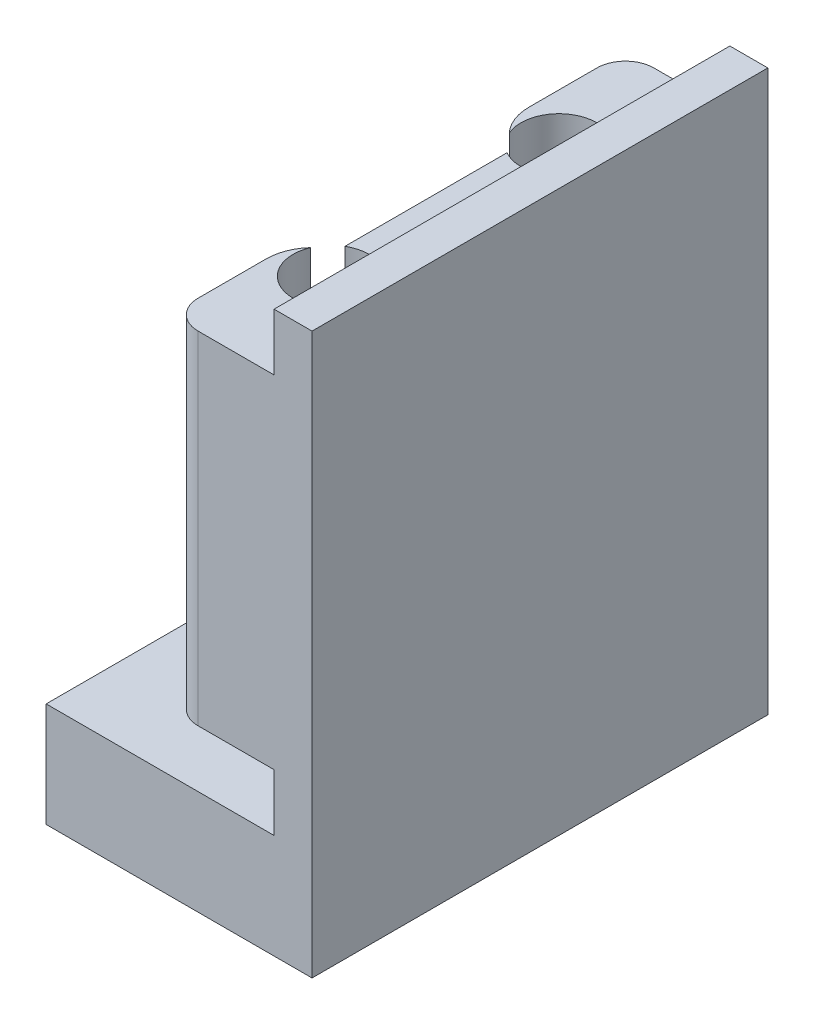
ISO-10303-21;
HEADER;
FILE_DESCRIPTION(('STEP AP214'),'2;1');
FILE_NAME('part.step','',(''),(''),'','','');
FILE_SCHEMA(('AUTOMOTIVE_DESIGN { 1 0 10303 214 1 1 1 1 }'));
ENDSEC;
DATA;
#1=APPLICATION_CONTEXT('core data for automotive mechanical design processes');
#2=APPLICATION_PROTOCOL_DEFINITION('international standard','automotive_design',2000,#1);
#3=PRODUCT_CONTEXT('',#1,'mechanical');
#4=PRODUCT('Part','Part','',(#3));
#5=PRODUCT_RELATED_PRODUCT_CATEGORY('part','',(#4));
#6=PRODUCT_DEFINITION_FORMATION('','',#4);
#7=PRODUCT_DEFINITION_CONTEXT('part definition',#1,'design');
#8=PRODUCT_DEFINITION('design','',#6,#7);
#9=PRODUCT_DEFINITION_SHAPE('','',#8);
#10=(LENGTH_UNIT() NAMED_UNIT(*) SI_UNIT(.MILLI.,.METRE.));
#11=(NAMED_UNIT(*) PLANE_ANGLE_UNIT() SI_UNIT($,.RADIAN.));
#12=(NAMED_UNIT(*) SI_UNIT($,.STERADIAN.) SOLID_ANGLE_UNIT());
#13=UNCERTAINTY_MEASURE_WITH_UNIT(LENGTH_MEASURE(1.E-05),#10,'distance_accuracy_value','');
#14=(GEOMETRIC_REPRESENTATION_CONTEXT(3) GLOBAL_UNCERTAINTY_ASSIGNED_CONTEXT((#13)) GLOBAL_UNIT_ASSIGNED_CONTEXT((#10,
#11,#12)) REPRESENTATION_CONTEXT('',''));
#15=CARTESIAN_POINT('',(0.,0.,0.));
#16=DIRECTION('',(0.,0.,1.));
#17=DIRECTION('',(1.,0.,0.));
#18=AXIS2_PLACEMENT_3D('',#15,#16,#17);
#19=CARTESIAN_POINT('',(0.500000000000001,26.5,12.));
#20=DIRECTION('',(1.,0.,0.));
#21=DIRECTION('',(0.,0.,-1.));
#22=AXIS2_PLACEMENT_3D('',#19,#20,#21);
#23=PLANE('',#22);
#24=DIRECTION('',(0.,0.,1.));
#25=VECTOR('',#24,1.);
#26=CARTESIAN_POINT('',(0.500000000000001,26.5,12.));
#27=LINE('',#26,#25);
#28=CARTESIAN_POINT('',(0.500000000000001,26.5,-10.5));
#29=VERTEX_POINT('',#28);
#30=CARTESIAN_POINT('',(0.500000000000001,26.5,-6.91628784747792));
#31=VERTEX_POINT('',#30);
#32=EDGE_CURVE('E200',#29,#31,#27,.T.);
#33=ORIENTED_EDGE('',*,*,#32,.F.);
#34=DIRECTION('',(0.,-1.,0.));
#35=VECTOR('',#34,1.);
#36=CARTESIAN_POINT('',(0.500000000000001,26.5,-10.5));
#37=LINE('',#36,#35);
#38=CARTESIAN_POINT('',(0.500000000000001,8.5,-10.5));
#39=VERTEX_POINT('',#38);
#40=EDGE_CURVE('E275',#29,#39,#37,.T.);
#41=ORIENTED_EDGE('',*,*,#40,.T.);
#42=DIRECTION('',(0.,0.,1.));
#43=VECTOR('',#42,1.);
#44=CARTESIAN_POINT('',(0.500000000000001,8.5,12.));
#45=LINE('',#44,#43);
#46=CARTESIAN_POINT('',(0.500000000000001,8.5,-6.91628784747792));
#47=VERTEX_POINT('',#46);
#48=EDGE_CURVE('E208',#39,#47,#45,.T.);
#49=ORIENTED_EDGE('',*,*,#48,.T.);
#50=DIRECTION('',(0.,1.,0.));
#51=VECTOR('',#50,1.);
#52=CARTESIAN_POINT('',(0.500000000000001,26.5,-6.91628784747792));
#53=LINE('',#52,#51);
#54=EDGE_CURVE('E268',#47,#31,#53,.T.);
#55=ORIENTED_EDGE('',*,*,#54,.T.);
#56=EDGE_LOOP('',(#33,#41,#49,#55));
#57=FACE_BOUND('',#56,.T.);
#58=ADVANCED_FACE('F34',(#57),#23,.F.);
#59=CARTESIAN_POINT('',(6.,29.5,12.));
#60=DIRECTION('',(1.,0.,0.));
#61=DIRECTION('',(0.,0.,-1.));
#62=AXIS2_PLACEMENT_3D('',#59,#60,#61);
#63=PLANE('',#62);
#64=DIRECTION('',(0.,0.,-1.));
#65=VECTOR('',#64,1.);
#66=CARTESIAN_POINT('',(6.,8.5,12.));
#67=LINE('',#66,#65);
#68=CARTESIAN_POINT('',(6.,8.5,12.));
#69=VERTEX_POINT('',#68);
#70=CARTESIAN_POINT('',(6.,8.5,-12.));
#71=VERTEX_POINT('',#70);
#72=EDGE_CURVE('E184',#69,#71,#67,.T.);
#73=ORIENTED_EDGE('',*,*,#72,.T.);
#74=DIRECTION('',(0.,-1.,0.));
#75=VECTOR('',#74,1.);
#76=CARTESIAN_POINT('',(6.,29.5,-12.));
#77=LINE('',#76,#75);
#78=CARTESIAN_POINT('',(6.,5.5,-12.));
#79=VERTEX_POINT('',#78);
#80=EDGE_CURVE('E220',#71,#79,#77,.T.);
#81=ORIENTED_EDGE('',*,*,#80,.T.);
#82=DIRECTION('',(0.,0.,-1.));
#83=VECTOR('',#82,1.);
#84=CARTESIAN_POINT('',(6.,5.5,12.));
#85=LINE('',#84,#83);
#86=CARTESIAN_POINT('',(6.,5.5,12.));
#87=VERTEX_POINT('',#86);
#88=EDGE_CURVE('E236',#87,#79,#85,.T.);
#89=ORIENTED_EDGE('',*,*,#88,.F.);
#90=DIRECTION('',(0.,-1.,0.));
#91=VECTOR('',#90,1.);
#92=CARTESIAN_POINT('',(6.,29.5,12.));
#93=LINE('',#92,#91);
#94=EDGE_CURVE('E231',#69,#87,#93,.T.);
#95=ORIENTED_EDGE('',*,*,#94,.F.);
#96=EDGE_LOOP('',(#73,#81,#89,#95));
#97=FACE_BOUND('',#96,.T.);
#98=ADVANCED_FACE('F301',(#97),#63,.F.);
#99=CARTESIAN_POINT('',(-6.,5.5,-12.));
#100=DIRECTION('',(0.,0.,1.));
#101=DIRECTION('',(1.,0.,0.));
#102=AXIS2_PLACEMENT_3D('',#99,#100,#101);
#103=PLANE('',#102);
#104=DIRECTION('',(-1.,0.,0.));
#105=VECTOR('',#104,1.);
#106=CARTESIAN_POINT('',(6.,8.5,-12.));
#107=LINE('',#106,#105);
#108=CARTESIAN_POINT('',(2.,8.5,-12.));
#109=VERTEX_POINT('',#108);
#110=EDGE_CURVE('E187',#71,#109,#107,.T.);
#111=ORIENTED_EDGE('',*,*,#110,.T.);
#112=DIRECTION('',(0.,-1.,0.));
#113=VECTOR('',#112,1.);
#114=CARTESIAN_POINT('',(2.,5.5,-12.));
#115=LINE('',#114,#113);
#116=CARTESIAN_POINT('',(2.,26.5,-12.));
#117=VERTEX_POINT('',#116);
#118=EDGE_CURVE('E282',#109,#117,#115,.F.);
#119=ORIENTED_EDGE('',*,*,#118,.T.);
#120=DIRECTION('',(-1.,0.,0.));
#121=VECTOR('',#120,1.);
#122=CARTESIAN_POINT('',(6.,26.5,-12.));
#123=LINE('',#122,#121);
#124=CARTESIAN_POINT('',(6.,26.5,-12.));
#125=VERTEX_POINT('',#124);
#126=EDGE_CURVE('E196',#125,#117,#123,.T.);
#127=ORIENTED_EDGE('',*,*,#126,.F.);
#128=CARTESIAN_POINT('',(6.,29.5,-12.));
#129=VERTEX_POINT('',#128);
#130=EDGE_CURVE('E223',#129,#125,#77,.T.);
#131=ORIENTED_EDGE('',*,*,#130,.F.);
#132=DIRECTION('',(-1.,0.,0.));
#133=VECTOR('',#132,1.);
#134=CARTESIAN_POINT('',(6.,29.5,-12.));
#135=LINE('',#134,#133);
#136=CARTESIAN_POINT('',(8.,29.5,-12.));
#137=VERTEX_POINT('',#136);
#138=EDGE_CURVE('E218',#137,#129,#135,.T.);
#139=ORIENTED_EDGE('',*,*,#138,.F.);
#140=DIRECTION('',(0.,-1.,0.));
#141=VECTOR('',#140,1.);
#142=CARTESIAN_POINT('',(8.,29.5,-12.));
#143=LINE('',#142,#141);
#144=CARTESIAN_POINT('',(8.,0.,-12.));
#145=VERTEX_POINT('',#144);
#146=EDGE_CURVE('E225',#137,#145,#143,.T.);
#147=ORIENTED_EDGE('',*,*,#146,.T.);
#148=DIRECTION('',(-1.,0.,0.));
#149=VECTOR('',#148,1.);
#150=CARTESIAN_POINT('',(-6.,0.,-12.));
#151=LINE('',#150,#149);
#152=CARTESIAN_POINT('',(-6.,0.,-12.));
#153=VERTEX_POINT('',#152);
#154=EDGE_CURVE('E235',#145,#153,#151,.T.);
#155=ORIENTED_EDGE('',*,*,#154,.T.);
#156=DIRECTION('',(0.,-1.,0.));
#157=VECTOR('',#156,1.);
#158=CARTESIAN_POINT('',(-6.,5.5,-12.));
#159=LINE('',#158,#157);
#160=CARTESIAN_POINT('',(-6.,5.5,-12.));
#161=VERTEX_POINT('',#160);
#162=EDGE_CURVE('E254',#161,#153,#159,.T.);
#163=ORIENTED_EDGE('',*,*,#162,.F.);
#164=DIRECTION('',(-1.,0.,0.));
#165=VECTOR('',#164,1.);
#166=CARTESIAN_POINT('',(-6.,5.5,-12.));
#167=LINE('',#166,#165);
#168=EDGE_CURVE('E239',#79,#161,#167,.T.);
#169=ORIENTED_EDGE('',*,*,#168,.F.);
#170=ORIENTED_EDGE('',*,*,#80,.F.);
#171=EDGE_LOOP('',(#111,#119,#127,#131,#139,#147,#155,#163,#169,#170));
#172=FACE_BOUND('',#171,.T.);
#173=ADVANCED_FACE('F305',(#172),#103,.F.);
#174=CARTESIAN_POINT('',(-6.,5.5,12.));
#175=DIRECTION('',(1.,0.,0.));
#176=DIRECTION('',(0.,0.,-1.));
#177=AXIS2_PLACEMENT_3D('',#174,#175,#176);
#178=PLANE('',#177);
#179=DIRECTION('',(0.,0.,1.));
#180=VECTOR('',#179,1.);
#181=CARTESIAN_POINT('',(-6.,0.,12.));
#182=LINE('',#181,#180);
#183=CARTESIAN_POINT('',(-6.,0.,12.));
#184=VERTEX_POINT('',#183);
#185=EDGE_CURVE('E249',#153,#184,#182,.T.);
#186=ORIENTED_EDGE('',*,*,#185,.T.);
#187=DIRECTION('',(0.,-1.,0.));
#188=VECTOR('',#187,1.);
#189=CARTESIAN_POINT('',(-6.,5.5,12.));
#190=LINE('',#189,#188);
#191=CARTESIAN_POINT('',(-6.,5.5,12.));
#192=VERTEX_POINT('',#191);
#193=EDGE_CURVE('E247',#192,#184,#190,.T.);
#194=ORIENTED_EDGE('',*,*,#193,.F.);
#195=DIRECTION('',(0.,0.,1.));
#196=VECTOR('',#195,1.);
#197=CARTESIAN_POINT('',(-6.,5.5,12.));
#198=LINE('',#197,#196);
#199=EDGE_CURVE('E242',#161,#192,#198,.T.);
#200=ORIENTED_EDGE('',*,*,#199,.F.);
#201=ORIENTED_EDGE('',*,*,#162,.T.);
#202=EDGE_LOOP('',(#186,#194,#200,#201));
#203=FACE_BOUND('',#202,.T.);
#204=ADVANCED_FACE('F417',(#203),#178,.F.);
#205=CARTESIAN_POINT('',(-6.,5.5,12.));
#206=DIRECTION('',(0.,0.,-1.));
#207=DIRECTION('',(-1.,0.,0.));
#208=AXIS2_PLACEMENT_3D('',#205,#206,#207);
#209=PLANE('',#208);
#210=DIRECTION('',(1.,0.,0.));
#211=VECTOR('',#210,1.);
#212=CARTESIAN_POINT('',(6.,26.5,12.));
#213=LINE('',#212,#211);
#214=CARTESIAN_POINT('',(2.,26.5,12.));
#215=VERTEX_POINT('',#214);
#216=CARTESIAN_POINT('',(6.,26.5,12.));
#217=VERTEX_POINT('',#216);
#218=EDGE_CURVE('E202',#215,#217,#213,.T.);
#219=ORIENTED_EDGE('',*,*,#218,.F.);
#220=DIRECTION('',(0.,-1.,0.));
#221=VECTOR('',#220,1.);
#222=CARTESIAN_POINT('',(2.,5.5,12.));
#223=LINE('',#222,#221);
#224=CARTESIAN_POINT('',(2.,8.5,12.));
#225=VERTEX_POINT('',#224);
#226=EDGE_CURVE('E42',#215,#225,#223,.T.);
#227=ORIENTED_EDGE('',*,*,#226,.T.);
#228=DIRECTION('',(1.,0.,0.));
#229=VECTOR('',#228,1.);
#230=CARTESIAN_POINT('',(6.,8.5,12.));
#231=LINE('',#230,#229);
#232=EDGE_CURVE('E197',#225,#69,#231,.T.);
#233=ORIENTED_EDGE('',*,*,#232,.T.);
#234=ORIENTED_EDGE('',*,*,#94,.T.);
#235=DIRECTION('',(1.,0.,0.));
#236=VECTOR('',#235,1.);
#237=CARTESIAN_POINT('',(-6.,5.5,12.));
#238=LINE('',#237,#236);
#239=EDGE_CURVE('E244',#192,#87,#238,.T.);
#240=ORIENTED_EDGE('',*,*,#239,.F.);
#241=ORIENTED_EDGE('',*,*,#193,.T.);
#242=DIRECTION('',(1.,0.,0.));
#243=VECTOR('',#242,1.);
#244=CARTESIAN_POINT('',(-6.,0.,12.));
#245=LINE('',#244,#243);
#246=CARTESIAN_POINT('',(8.,0.,12.));
#247=VERTEX_POINT('',#246);
#248=EDGE_CURVE('E240',#184,#247,#245,.T.);
#249=ORIENTED_EDGE('',*,*,#248,.T.);
#250=DIRECTION('',(0.,-1.,0.));
#251=VECTOR('',#250,1.);
#252=CARTESIAN_POINT('',(8.,29.5,12.));
#253=LINE('',#252,#251);
#254=CARTESIAN_POINT('',(8.,29.5,12.));
#255=VERTEX_POINT('',#254);
#256=EDGE_CURVE('E228',#255,#247,#253,.T.);
#257=ORIENTED_EDGE('',*,*,#256,.F.);
#258=DIRECTION('',(1.,0.,0.));
#259=VECTOR('',#258,1.);
#260=CARTESIAN_POINT('',(6.,29.5,12.));
#261=LINE('',#260,#259);
#262=CARTESIAN_POINT('',(6.,29.5,12.));
#263=VERTEX_POINT('',#262);
#264=EDGE_CURVE('E214',#263,#255,#261,.T.);
#265=ORIENTED_EDGE('',*,*,#264,.F.);
#266=EDGE_CURVE('E232',#263,#217,#93,.T.);
#267=ORIENTED_EDGE('',*,*,#266,.T.);
#268=EDGE_LOOP('',(#219,#227,#233,#234,#240,#241,#249,#257,#265,#267));
#269=FACE_BOUND('',#268,.T.);
#270=ADVANCED_FACE('F290',(#269),#209,.F.);
#271=CARTESIAN_POINT('',(0.,5.5,0.));
#272=DIRECTION('',(0.,-1.,0.));
#273=DIRECTION('',(0.,0.,-1.));
#274=AXIS2_PLACEMENT_3D('',#271,#272,#273);
#275=PLANE('',#274);
#276=CARTESIAN_POINT('',(3.,5.5,6.));
#277=DIRECTION('',(0.,-1.,0.));
#278=DIRECTION('',(0.,0.,-1.));
#279=AXIS2_PLACEMENT_3D('',#276,#277,#278);
#280=CIRCLE('',#279,2.);
#281=CARTESIAN_POINT('',(3.,5.5,4.));
#282=VERTEX_POINT('',#281);
#283=EDGE_CURVE('E189',#282,#282,#280,.T.);
#284=ORIENTED_EDGE('',*,*,#283,.T.);
#285=EDGE_LOOP('',(#284));
#286=FACE_BOUND('',#285,.T.);
#287=CARTESIAN_POINT('',(3.,5.5,-6.));
#288=DIRECTION('',(0.,-1.,0.));
#289=DIRECTION('',(0.,0.,-1.));
#290=AXIS2_PLACEMENT_3D('',#287,#288,#289);
#291=CIRCLE('',#290,2.);
#292=CARTESIAN_POINT('',(3.,5.5,-8.));
#293=VERTEX_POINT('',#292);
#294=EDGE_CURVE('E169',#293,#293,#291,.T.);
#295=ORIENTED_EDGE('',*,*,#294,.T.);
#296=EDGE_LOOP('',(#295));
#297=FACE_BOUND('',#296,.T.);
#298=ORIENTED_EDGE('',*,*,#88,.T.);
#299=ORIENTED_EDGE('',*,*,#168,.T.);
#300=ORIENTED_EDGE('',*,*,#199,.T.);
#301=ORIENTED_EDGE('',*,*,#239,.T.);
#302=EDGE_LOOP('',(#298,#299,#300,#301));
#303=FACE_BOUND('',#302,.T.);
#304=ADVANCED_FACE('F310',(#286,#297,#303),#275,.F.);
#305=CARTESIAN_POINT('',(0.,0.,0.));
#306=DIRECTION('',(0.,-1.,0.));
#307=DIRECTION('',(0.,0.,-1.));
#308=AXIS2_PLACEMENT_3D('',#305,#306,#307);
#309=PLANE('',#308);
#310=CARTESIAN_POINT('',(3.,0.,6.));
#311=DIRECTION('',(0.,1.,0.));
#312=DIRECTION('',(0.,0.,1.));
#313=AXIS2_PLACEMENT_3D('',#310,#311,#312);
#314=CIRCLE('',#313,2.);
#315=CARTESIAN_POINT('',(3.,0.,8.));
#316=VERTEX_POINT('',#315);
#317=EDGE_CURVE('E560',#316,#316,#314,.T.);
#318=ORIENTED_EDGE('',*,*,#317,.T.);
#319=EDGE_LOOP('',(#318));
#320=FACE_BOUND('',#319,.T.);
#321=CARTESIAN_POINT('',(3.,0.,-6.));
#322=DIRECTION('',(0.,1.,0.));
#323=DIRECTION('',(0.,0.,-1.));
#324=AXIS2_PLACEMENT_3D('',#321,#322,#323);
#325=CIRCLE('',#324,2.);
#326=CARTESIAN_POINT('',(3.,0.,-8.));
#327=VERTEX_POINT('',#326);
#328=EDGE_CURVE('E179',#327,#327,#325,.T.);
#329=ORIENTED_EDGE('',*,*,#328,.T.);
#330=EDGE_LOOP('',(#329));
#331=FACE_BOUND('',#330,.T.);
#332=ORIENTED_EDGE('',*,*,#154,.F.);
#333=DIRECTION('',(0.,0.,-1.));
#334=VECTOR('',#333,1.);
#335=CARTESIAN_POINT('',(8.,0.,12.));
#336=LINE('',#335,#334);
#337=EDGE_CURVE('E203',#247,#145,#336,.T.);
#338=ORIENTED_EDGE('',*,*,#337,.F.);
#339=ORIENTED_EDGE('',*,*,#248,.F.);
#340=ORIENTED_EDGE('',*,*,#185,.F.);
#341=EDGE_LOOP('',(#332,#338,#339,#340));
#342=FACE_BOUND('',#341,.T.);
#343=ADVANCED_FACE('F319',(#320,#331,#342),#309,.T.);
#344=ORIENTED_EDGE('',*,*,#130,.T.);
#345=DIRECTION('',(0.,0.,-1.));
#346=VECTOR('',#345,1.);
#347=CARTESIAN_POINT('',(6.,26.5,12.));
#348=LINE('',#347,#346);
#349=EDGE_CURVE('E193',#217,#125,#348,.T.);
#350=ORIENTED_EDGE('',*,*,#349,.F.);
#351=ORIENTED_EDGE('',*,*,#266,.F.);
#352=DIRECTION('',(0.,0.,1.));
#353=VECTOR('',#352,1.);
#354=CARTESIAN_POINT('',(6.,29.5,12.));
#355=LINE('',#354,#353);
#356=EDGE_CURVE('E211',#129,#263,#355,.T.);
#357=ORIENTED_EDGE('',*,*,#356,.F.);
#358=EDGE_LOOP('',(#344,#350,#351,#357));
#359=FACE_BOUND('',#358,.T.);
#360=ADVANCED_FACE('F333',(#359),#63,.F.);
#361=CARTESIAN_POINT('',(8.,29.5,12.));
#362=DIRECTION('',(-1.,0.,0.));
#363=DIRECTION('',(0.,0.,1.));
#364=AXIS2_PLACEMENT_3D('',#361,#362,#363);
#365=PLANE('',#364);
#366=ORIENTED_EDGE('',*,*,#337,.T.);
#367=ORIENTED_EDGE('',*,*,#146,.F.);
#368=DIRECTION('',(0.,0.,-1.));
#369=VECTOR('',#368,1.);
#370=CARTESIAN_POINT('',(8.,29.5,12.));
#371=LINE('',#370,#369);
#372=EDGE_CURVE('E216',#255,#137,#371,.T.);
#373=ORIENTED_EDGE('',*,*,#372,.F.);
#374=ORIENTED_EDGE('',*,*,#256,.T.);
#375=EDGE_LOOP('',(#366,#367,#373,#374));
#376=FACE_BOUND('',#375,.T.);
#377=ADVANCED_FACE('F322',(#376),#365,.F.);
#378=CARTESIAN_POINT('',(0.,29.5,0.));
#379=DIRECTION('',(0.,-1.,0.));
#380=DIRECTION('',(0.,0.,-1.));
#381=AXIS2_PLACEMENT_3D('',#378,#379,#380);
#382=PLANE('',#381);
#383=ORIENTED_EDGE('',*,*,#356,.T.);
#384=ORIENTED_EDGE('',*,*,#264,.T.);
#385=ORIENTED_EDGE('',*,*,#372,.T.);
#386=ORIENTED_EDGE('',*,*,#138,.T.);
#387=EDGE_LOOP('',(#383,#384,#385,#386));
#388=FACE_BOUND('',#387,.T.);
#389=ADVANCED_FACE('F329',(#388),#382,.F.);
#390=CARTESIAN_POINT('',(0.500000000000001,8.5,6.91628784747793));
#391=VERTEX_POINT('',#390);
#392=CARTESIAN_POINT('',(0.500000000000001,8.5,10.5));
#393=VERTEX_POINT('',#392);
#394=EDGE_CURVE('E207',#391,#393,#45,.T.);
#395=ORIENTED_EDGE('',*,*,#394,.T.);
#396=DIRECTION('',(0.,-1.,0.));
#397=VECTOR('',#396,1.);
#398=CARTESIAN_POINT('',(0.500000000000001,26.5,10.5));
#399=LINE('',#398,#397);
#400=CARTESIAN_POINT('',(0.500000000000001,26.5,10.5));
#401=VERTEX_POINT('',#400);
#402=EDGE_CURVE('E11',#393,#401,#399,.F.);
#403=ORIENTED_EDGE('',*,*,#402,.T.);
#404=CARTESIAN_POINT('',(0.500000000000001,26.5,6.91628784747792));
#405=VERTEX_POINT('',#404);
#406=EDGE_CURVE('E199',#405,#401,#27,.T.);
#407=ORIENTED_EDGE('',*,*,#406,.F.);
#408=DIRECTION('',(0.,-1.,0.));
#409=VECTOR('',#408,1.);
#410=CARTESIAN_POINT('',(0.500000000000001,26.5,6.91628784747792));
#411=LINE('',#410,#409);
#412=EDGE_CURVE('E260',#405,#391,#411,.T.);
#413=ORIENTED_EDGE('',*,*,#412,.T.);
#414=EDGE_LOOP('',(#395,#403,#407,#413));
#415=FACE_BOUND('',#414,.T.);
#416=ADVANCED_FACE('F358',(#415),#23,.F.);
#417=CARTESIAN_POINT('',(0.,26.5,0.));
#418=DIRECTION('',(0.,1.,0.));
#419=DIRECTION('',(0.,0.,1.));
#420=AXIS2_PLACEMENT_3D('',#417,#418,#419);
#421=PLANE('',#420);
#422=ORIENTED_EDGE('',*,*,#126,.T.);
#423=CARTESIAN_POINT('',(2.,26.5,-10.5));
#424=DIRECTION('',(0.,1.,0.));
#425=DIRECTION('',(0.,0.,1.));
#426=AXIS2_PLACEMENT_3D('',#423,#424,#425);
#427=CIRCLE('',#426,1.5);
#428=EDGE_CURVE('E285',#117,#29,#427,.T.);
#429=ORIENTED_EDGE('',*,*,#428,.T.);
#430=ORIENTED_EDGE('',*,*,#32,.T.);
#431=CARTESIAN_POINT('',(3.,26.5,-6.91628784747792));
#432=DIRECTION('',(0.,1.,0.));
#433=DIRECTION('',(0.,0.,1.));
#434=AXIS2_PLACEMENT_3D('',#431,#432,#433);
#435=CIRCLE('',#434,2.5);
#436=CARTESIAN_POINT('',(1.15401513251041,26.5,-5.23036380737426));
#437=VERTEX_POINT('',#436);
#438=EDGE_CURVE('E178',#31,#437,#435,.T.);
#439=ORIENTED_EDGE('',*,*,#438,.T.);
#440=CARTESIAN_POINT('',(3.,26.5,-6.));
#441=DIRECTION('',(0.,1.,0.));
#442=DIRECTION('',(0.,0.,-1.));
#443=AXIS2_PLACEMENT_3D('',#440,#441,#442);
#444=CIRCLE('',#443,2.);
#445=CARTESIAN_POINT('',(2.,26.5,-4.26794919243112));
#446=VERTEX_POINT('',#445);
#447=EDGE_CURVE('E161',#446,#437,#444,.T.);
#448=ORIENTED_EDGE('',*,*,#447,.F.);
#449=DIRECTION('',(0.,0.,-1.));
#450=VECTOR('',#449,1.);
#451=CARTESIAN_POINT('',(2.,26.5,-4.625));
#452=LINE('',#451,#450);
#453=CARTESIAN_POINT('',(2.,26.5,4.26794919243112));
#454=VERTEX_POINT('',#453);
#455=EDGE_CURVE('E176',#454,#446,#452,.T.);
#456=ORIENTED_EDGE('',*,*,#455,.F.);
#457=CARTESIAN_POINT('',(3.,26.5,6.));
#458=DIRECTION('',(0.,1.,0.));
#459=DIRECTION('',(0.,0.,1.));
#460=AXIS2_PLACEMENT_3D('',#457,#458,#459);
#461=CIRCLE('',#460,2.);
#462=CARTESIAN_POINT('',(1.15401513251041,26.5,5.23036380737426));
#463=VERTEX_POINT('',#462);
#464=EDGE_CURVE('E398',#463,#454,#461,.T.);
#465=ORIENTED_EDGE('',*,*,#464,.F.);
#466=CARTESIAN_POINT('',(3.,26.5,6.91628784747792));
#467=DIRECTION('',(0.,1.,0.));
#468=DIRECTION('',(0.,0.,1.));
#469=AXIS2_PLACEMENT_3D('',#466,#467,#468);
#470=CIRCLE('',#469,2.5);
#471=EDGE_CURVE('E258',#463,#405,#470,.T.);
#472=ORIENTED_EDGE('',*,*,#471,.T.);
#473=ORIENTED_EDGE('',*,*,#406,.T.);
#474=CARTESIAN_POINT('',(2.,26.5,10.5));
#475=DIRECTION('',(0.,1.,0.));
#476=DIRECTION('',(0.,0.,1.));
#477=AXIS2_PLACEMENT_3D('',#474,#475,#476);
#478=CIRCLE('',#477,1.5);
#479=EDGE_CURVE('E49',#401,#215,#478,.T.);
#480=ORIENTED_EDGE('',*,*,#479,.T.);
#481=ORIENTED_EDGE('',*,*,#218,.T.);
#482=ORIENTED_EDGE('',*,*,#349,.T.);
#483=EDGE_LOOP('',(#422,#429,#430,#439,#448,#456,#465,#472,#473,#480,#481,#482));
#484=FACE_BOUND('',#483,.T.);
#485=ADVANCED_FACE('F174',(#484),#421,.T.);
#486=CARTESIAN_POINT('',(0.,8.5,0.));
#487=DIRECTION('',(0.,1.,0.));
#488=DIRECTION('',(0.,0.,1.));
#489=AXIS2_PLACEMENT_3D('',#486,#487,#488);
#490=PLANE('',#489);
#491=ORIENTED_EDGE('',*,*,#48,.F.);
#492=CARTESIAN_POINT('',(2.,8.5,-10.5));
#493=DIRECTION('',(0.,1.,0.));
#494=DIRECTION('',(0.,0.,1.));
#495=AXIS2_PLACEMENT_3D('',#492,#493,#494);
#496=CIRCLE('',#495,1.5);
#497=EDGE_CURVE('E280',#39,#109,#496,.F.);
#498=ORIENTED_EDGE('',*,*,#497,.T.);
#499=ORIENTED_EDGE('',*,*,#110,.F.);
#500=ORIENTED_EDGE('',*,*,#72,.F.);
#501=ORIENTED_EDGE('',*,*,#232,.F.);
#502=CARTESIAN_POINT('',(2.,8.5,10.5));
#503=DIRECTION('',(0.,1.,0.));
#504=DIRECTION('',(0.,0.,1.));
#505=AXIS2_PLACEMENT_3D('',#502,#503,#504);
#506=CIRCLE('',#505,1.5);
#507=EDGE_CURVE('E278',#225,#393,#506,.F.);
#508=ORIENTED_EDGE('',*,*,#507,.T.);
#509=ORIENTED_EDGE('',*,*,#394,.F.);
#510=CARTESIAN_POINT('',(3.,8.5,6.91628784747793));
#511=DIRECTION('',(0.,1.,0.));
#512=DIRECTION('',(0.,0.,1.));
#513=AXIS2_PLACEMENT_3D('',#510,#511,#512);
#514=CIRCLE('',#513,2.5);
#515=CARTESIAN_POINT('',(1.15401513251041,8.5,5.23036380737427));
#516=VERTEX_POINT('',#515);
#517=EDGE_CURVE('E265',#391,#516,#514,.F.);
#518=ORIENTED_EDGE('',*,*,#517,.T.);
#519=CARTESIAN_POINT('',(3.,8.5,6.));
#520=DIRECTION('',(0.,1.,0.));
#521=DIRECTION('',(0.,0.,1.));
#522=AXIS2_PLACEMENT_3D('',#519,#520,#521);
#523=CIRCLE('',#522,2.);
#524=CARTESIAN_POINT('',(2.,8.5,4.26794919243112));
#525=VERTEX_POINT('',#524);
#526=EDGE_CURVE('E396',#516,#525,#523,.T.);
#527=ORIENTED_EDGE('',*,*,#526,.T.);
#528=DIRECTION('',(0.,0.,1.));
#529=VECTOR('',#528,1.);
#530=CARTESIAN_POINT('',(2.,8.5,-4.625));
#531=LINE('',#530,#529);
#532=CARTESIAN_POINT('',(2.,8.5,-4.26794919243112));
#533=VERTEX_POINT('',#532);
#534=EDGE_CURVE('E185',#533,#525,#531,.T.);
#535=ORIENTED_EDGE('',*,*,#534,.F.);
#536=CARTESIAN_POINT('',(3.,8.5,-6.));
#537=DIRECTION('',(0.,1.,0.));
#538=DIRECTION('',(0.,0.,1.));
#539=AXIS2_PLACEMENT_3D('',#536,#537,#538);
#540=CIRCLE('',#539,2.);
#541=CARTESIAN_POINT('',(1.15401513251041,8.5,-5.23036380737426));
#542=VERTEX_POINT('',#541);
#543=EDGE_CURVE('E164',#533,#542,#540,.T.);
#544=ORIENTED_EDGE('',*,*,#543,.T.);
#545=CARTESIAN_POINT('',(3.,8.5,-6.91628784747792));
#546=DIRECTION('',(0.,1.,0.));
#547=DIRECTION('',(0.,0.,1.));
#548=AXIS2_PLACEMENT_3D('',#545,#546,#547);
#549=CIRCLE('',#548,2.5);
#550=EDGE_CURVE('E262',#542,#47,#549,.F.);
#551=ORIENTED_EDGE('',*,*,#550,.T.);
#552=EDGE_LOOP('',(#491,#498,#499,#500,#501,#508,#509,#518,#527,#535,#544,#551));
#553=FACE_BOUND('',#552,.T.);
#554=ADVANCED_FACE('F296',(#553),#490,.F.);
#555=CARTESIAN_POINT('',(2.,0.,0.));
#556=DIRECTION('',(-1.,0.,0.));
#557=DIRECTION('',(0.,0.,1.));
#558=AXIS2_PLACEMENT_3D('',#555,#556,#557);
#559=PLANE('',#558);
#560=DIRECTION('',(0.,1.,0.));
#561=VECTOR('',#560,1.);
#562=CARTESIAN_POINT('',(2.,0.,4.26794919243112));
#563=LINE('',#562,#561);
#564=EDGE_CURVE('E183',#454,#525,#563,.F.);
#565=ORIENTED_EDGE('',*,*,#564,.F.);
#566=ORIENTED_EDGE('',*,*,#455,.T.);
#567=DIRECTION('',(0.,1.,0.));
#568=VECTOR('',#567,1.);
#569=CARTESIAN_POINT('',(2.,0.,-4.26794919243112));
#570=LINE('',#569,#568);
#571=EDGE_CURVE('E158',#533,#446,#570,.T.);
#572=ORIENTED_EDGE('',*,*,#571,.F.);
#573=ORIENTED_EDGE('',*,*,#534,.T.);
#574=EDGE_LOOP('',(#565,#566,#572,#573));
#575=FACE_BOUND('',#574,.T.);
#576=ADVANCED_FACE('F182',(#575),#559,.T.);
#577=CARTESIAN_POINT('',(3.,26.5,6.91628784747792));
#578=DIRECTION('',(0.,-1.,0.));
#579=DIRECTION('',(0.,0.,-1.));
#580=AXIS2_PLACEMENT_3D('',#577,#578,#579);
#581=CYLINDRICAL_SURFACE('',#580,2.5);
#582=DIRECTION('',(0.,1.,0.));
#583=VECTOR('',#582,1.);
#584=CARTESIAN_POINT('',(1.15401513251041,13.25,5.23036380737427));
#585=LINE('',#584,#583);
#586=EDGE_CURVE('E273',#516,#463,#585,.T.);
#587=ORIENTED_EDGE('',*,*,#586,.F.);
#588=ORIENTED_EDGE('',*,*,#517,.F.);
#589=ORIENTED_EDGE('',*,*,#412,.F.);
#590=ORIENTED_EDGE('',*,*,#471,.F.);
#591=EDGE_LOOP('',(#587,#588,#589,#590));
#592=FACE_BOUND('',#591,.T.);
#593=ADVANCED_FACE('F345',(#592),#581,.T.);
#594=CARTESIAN_POINT('',(3.,26.5,-6.91628784747792));
#595=DIRECTION('',(0.,1.,0.));
#596=DIRECTION('',(0.,0.,1.));
#597=AXIS2_PLACEMENT_3D('',#594,#595,#596);
#598=CYLINDRICAL_SURFACE('',#597,2.5);
#599=DIRECTION('',(0.,1.,0.));
#600=VECTOR('',#599,1.);
#601=CARTESIAN_POINT('',(1.15401513251041,13.25,-5.23036380737426));
#602=LINE('',#601,#600);
#603=EDGE_CURVE('E271',#437,#542,#602,.F.);
#604=ORIENTED_EDGE('',*,*,#603,.F.);
#605=ORIENTED_EDGE('',*,*,#438,.F.);
#606=ORIENTED_EDGE('',*,*,#54,.F.);
#607=ORIENTED_EDGE('',*,*,#550,.F.);
#608=EDGE_LOOP('',(#604,#605,#606,#607));
#609=FACE_BOUND('',#608,.T.);
#610=ADVANCED_FACE('F343',(#609),#598,.T.);
#611=CARTESIAN_POINT('',(3.,0.,-6.));
#612=DIRECTION('',(0.,1.,0.));
#613=DIRECTION('',(0.,0.,1.));
#614=AXIS2_PLACEMENT_3D('',#611,#612,#613);
#615=CYLINDRICAL_SURFACE('',#614,2.);
#616=ORIENTED_EDGE('',*,*,#571,.T.);
#617=ORIENTED_EDGE('',*,*,#447,.T.);
#618=ORIENTED_EDGE('',*,*,#603,.T.);
#619=ORIENTED_EDGE('',*,*,#543,.F.);
#620=EDGE_LOOP('',(#616,#617,#618,#619));
#621=FACE_BOUND('',#620,.T.);
#622=ADVANCED_FACE('F160',(#621),#615,.F.);
#623=CARTESIAN_POINT('',(3.,0.,6.));
#624=DIRECTION('',(0.,1.,0.));
#625=DIRECTION('',(0.,0.,1.));
#626=AXIS2_PLACEMENT_3D('',#623,#624,#625);
#627=CYLINDRICAL_SURFACE('',#626,2.);
#628=ORIENTED_EDGE('',*,*,#564,.T.);
#629=ORIENTED_EDGE('',*,*,#526,.F.);
#630=ORIENTED_EDGE('',*,*,#586,.T.);
#631=ORIENTED_EDGE('',*,*,#464,.T.);
#632=EDGE_LOOP('',(#628,#629,#630,#631));
#633=FACE_BOUND('',#632,.T.);
#634=ADVANCED_FACE('F351',(#633),#627,.F.);
#635=ORIENTED_EDGE('',*,*,#328,.F.);
#636=EDGE_LOOP('',(#635));
#637=FACE_BOUND('',#636,.T.);
#638=ORIENTED_EDGE('',*,*,#294,.F.);
#639=EDGE_LOOP('',(#638));
#640=FACE_BOUND('',#639,.T.);
#641=ADVANCED_FACE('F353',(#637,#640),#615,.F.);
#642=ORIENTED_EDGE('',*,*,#317,.F.);
#643=EDGE_LOOP('',(#642));
#644=FACE_BOUND('',#643,.T.);
#645=ORIENTED_EDGE('',*,*,#283,.F.);
#646=EDGE_LOOP('',(#645));
#647=FACE_BOUND('',#646,.T.);
#648=ADVANCED_FACE('F380',(#644,#647),#627,.F.);
#649=CARTESIAN_POINT('',(2.,26.5,-10.5));
#650=DIRECTION('',(0.,-1.,0.));
#651=DIRECTION('',(0.,0.,-1.));
#652=AXIS2_PLACEMENT_3D('',#649,#650,#651);
#653=CYLINDRICAL_SURFACE('',#652,1.5);
#654=ORIENTED_EDGE('',*,*,#428,.F.);
#655=ORIENTED_EDGE('',*,*,#118,.F.);
#656=ORIENTED_EDGE('',*,*,#497,.F.);
#657=ORIENTED_EDGE('',*,*,#40,.F.);
#658=EDGE_LOOP('',(#654,#655,#656,#657));
#659=FACE_BOUND('',#658,.T.);
#660=ADVANCED_FACE('F338',(#659),#653,.T.);
#661=CARTESIAN_POINT('',(2.,5.5,10.5));
#662=DIRECTION('',(0.,-1.,0.));
#663=DIRECTION('',(0.,0.,-1.));
#664=AXIS2_PLACEMENT_3D('',#661,#662,#663);
#665=CYLINDRICAL_SURFACE('',#664,1.5);
#666=ORIENTED_EDGE('',*,*,#479,.F.);
#667=ORIENTED_EDGE('',*,*,#402,.F.);
#668=ORIENTED_EDGE('',*,*,#507,.F.);
#669=ORIENTED_EDGE('',*,*,#226,.F.);
#670=EDGE_LOOP('',(#666,#667,#668,#669));
#671=FACE_BOUND('',#670,.T.);
#672=ADVANCED_FACE('F36',(#671),#665,.T.);
#673=CLOSED_SHELL('',(#58,#98,#173,#204,#270,#304,#343,#360,#377,#389,#416,#485,#554,#576,#593,
#610,#622,#634,#641,#648,#660,#672));
#674=MANIFOLD_SOLID_BREP('B2',#673);
#675=ADVANCED_BREP_SHAPE_REPRESENTATION('',(#18,#674),#14);
#676=SHAPE_DEFINITION_REPRESENTATION(#9,#675);
ENDSEC;
END-ISO-10303-21;
